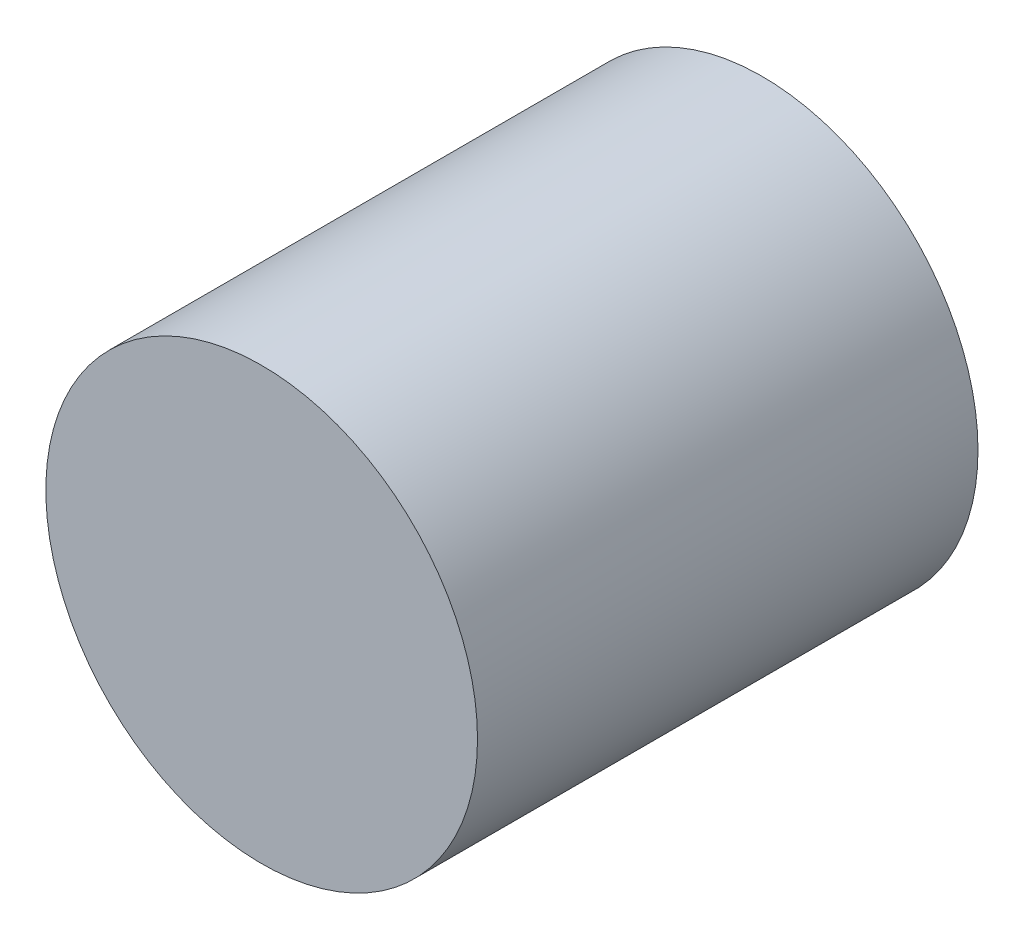
ISO-10303-21;
HEADER;
FILE_DESCRIPTION(('STEP AP214'),'2;1');
FILE_NAME('part.step','',(''),(''),'','','');
FILE_SCHEMA(('AUTOMOTIVE_DESIGN { 1 0 10303 214 1 1 1 1 }'));
ENDSEC;
DATA;
#1=APPLICATION_CONTEXT('core data for automotive mechanical design processes');
#2=APPLICATION_PROTOCOL_DEFINITION('international standard','automotive_design',2000,#1);
#3=PRODUCT_CONTEXT('',#1,'mechanical');
#4=PRODUCT('Part','Part','',(#3));
#5=PRODUCT_RELATED_PRODUCT_CATEGORY('part','',(#4));
#6=PRODUCT_DEFINITION_FORMATION('','',#4);
#7=PRODUCT_DEFINITION_CONTEXT('part definition',#1,'design');
#8=PRODUCT_DEFINITION('design','',#6,#7);
#9=PRODUCT_DEFINITION_SHAPE('','',#8);
#10=(LENGTH_UNIT() NAMED_UNIT(*) SI_UNIT(.MILLI.,.METRE.));
#11=(NAMED_UNIT(*) PLANE_ANGLE_UNIT() SI_UNIT($,.RADIAN.));
#12=(NAMED_UNIT(*) SI_UNIT($,.STERADIAN.) SOLID_ANGLE_UNIT());
#13=UNCERTAINTY_MEASURE_WITH_UNIT(LENGTH_MEASURE(1.E-05),#10,'distance_accuracy_value','');
#14=(GEOMETRIC_REPRESENTATION_CONTEXT(3) GLOBAL_UNCERTAINTY_ASSIGNED_CONTEXT((#13)) GLOBAL_UNIT_ASSIGNED_CONTEXT((#10,
#11,#12)) REPRESENTATION_CONTEXT('',''));
#15=CARTESIAN_POINT('',(0.,0.,0.));
#16=DIRECTION('',(0.,0.,1.));
#17=DIRECTION('',(1.,0.,0.));
#18=AXIS2_PLACEMENT_3D('',#15,#16,#17);
#19=CARTESIAN_POINT('',(0.,0.,4.064));
#20=DIRECTION('',(0.,0.,-1.));
#21=DIRECTION('',(-1.,0.,0.));
#22=AXIS2_PLACEMENT_3D('',#19,#20,#21);
#23=CYLINDRICAL_SURFACE('',#22,1.7526);
#24=CARTESIAN_POINT('',(0.,0.,4.064));
#25=DIRECTION('',(0.,0.,1.));
#26=DIRECTION('',(1.,0.,0.));
#27=AXIS2_PLACEMENT_3D('',#24,#25,#26);
#28=CIRCLE('',#27,1.7526);
#29=CARTESIAN_POINT('',(1.7526,0.,4.064));
#30=VERTEX_POINT('',#29);
#31=EDGE_CURVE('E10',#30,#30,#28,.T.);
#32=ORIENTED_EDGE('',*,*,#31,.F.);
#33=EDGE_LOOP('',(#32));
#34=FACE_BOUND('',#33,.T.);
#35=CARTESIAN_POINT('',(0.,0.,0.));
#36=DIRECTION('',(0.,0.,1.));
#37=DIRECTION('',(1.,0.,0.));
#38=AXIS2_PLACEMENT_3D('',#35,#36,#37);
#39=CIRCLE('',#38,1.7526);
#40=CARTESIAN_POINT('',(1.7526,0.,0.));
#41=VERTEX_POINT('',#40);
#42=EDGE_CURVE('E34',#41,#41,#39,.T.);
#43=ORIENTED_EDGE('',*,*,#42,.T.);
#44=EDGE_LOOP('',(#43));
#45=FACE_BOUND('',#44,.T.);
#46=ADVANCED_FACE('F31',(#34,#45),#23,.T.);
#47=CARTESIAN_POINT('',(0.,0.,4.064));
#48=DIRECTION('',(0.,0.,1.));
#49=DIRECTION('',(1.,0.,0.));
#50=AXIS2_PLACEMENT_3D('',#47,#48,#49);
#51=PLANE('',#50);
#52=ORIENTED_EDGE('',*,*,#31,.T.);
#53=EDGE_LOOP('',(#52));
#54=FACE_BOUND('',#53,.T.);
#55=ADVANCED_FACE('F46',(#54),#51,.T.);
#56=CARTESIAN_POINT('',(0.,0.,0.));
#57=DIRECTION('',(0.,0.,1.));
#58=DIRECTION('',(1.,0.,0.));
#59=AXIS2_PLACEMENT_3D('',#56,#57,#58);
#60=PLANE('',#59);
#61=ORIENTED_EDGE('',*,*,#42,.F.);
#62=EDGE_LOOP('',(#61));
#63=FACE_BOUND('',#62,.T.);
#64=ADVANCED_FACE('F44',(#63),#60,.F.);
#65=CLOSED_SHELL('',(#46,#55,#64));
#66=MANIFOLD_SOLID_BREP('B2',#65);
#67=ADVANCED_BREP_SHAPE_REPRESENTATION('',(#18,#66),#14);
#68=SHAPE_DEFINITION_REPRESENTATION(#9,#67);
ENDSEC;
END-ISO-10303-21;
